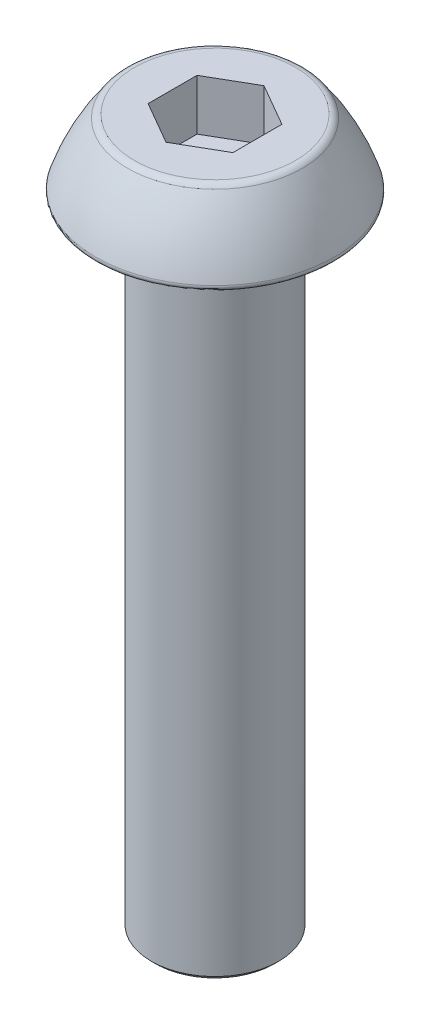
ISO-10303-21;
HEADER;
FILE_DESCRIPTION(('STEP AP214'),'2;1');
FILE_NAME('part.step','',(''),(''),'','','');
FILE_SCHEMA(('AUTOMOTIVE_DESIGN { 1 0 10303 214 1 1 1 1 }'));
ENDSEC;
DATA;
#1=APPLICATION_CONTEXT('core data for automotive mechanical design processes');
#2=APPLICATION_PROTOCOL_DEFINITION('international standard','automotive_design',2000,#1);
#3=PRODUCT_CONTEXT('',#1,'mechanical');
#4=PRODUCT('Part','Part','',(#3));
#5=PRODUCT_RELATED_PRODUCT_CATEGORY('part','',(#4));
#6=PRODUCT_DEFINITION_FORMATION('','',#4);
#7=PRODUCT_DEFINITION_CONTEXT('part definition',#1,'design');
#8=PRODUCT_DEFINITION('design','',#6,#7);
#9=PRODUCT_DEFINITION_SHAPE('','',#8);
#10=(LENGTH_UNIT() NAMED_UNIT(*) SI_UNIT(.MILLI.,.METRE.));
#11=(NAMED_UNIT(*) PLANE_ANGLE_UNIT() SI_UNIT($,.RADIAN.));
#12=(NAMED_UNIT(*) SI_UNIT($,.STERADIAN.) SOLID_ANGLE_UNIT());
#13=UNCERTAINTY_MEASURE_WITH_UNIT(LENGTH_MEASURE(1.E-05),#10,'distance_accuracy_value','');
#14=(GEOMETRIC_REPRESENTATION_CONTEXT(3) GLOBAL_UNCERTAINTY_ASSIGNED_CONTEXT((#13)) GLOBAL_UNIT_ASSIGNED_CONTEXT((#10,
#11,#12)) REPRESENTATION_CONTEXT('',''));
#15=CARTESIAN_POINT('',(0.,0.,0.));
#16=DIRECTION('',(0.,0.,1.));
#17=DIRECTION('',(1.,0.,0.));
#18=AXIS2_PLACEMENT_3D('',#15,#16,#17);
#19=CARTESIAN_POINT('',(0.,0.,0.));
#20=DIRECTION('',(0.,1.,0.));
#21=DIRECTION('',(0.,0.,1.));
#22=AXIS2_PLACEMENT_3D('',#19,#20,#21);
#23=PLANE('',#22);
#24=CARTESIAN_POINT('',(0.,0.,0.));
#25=DIRECTION('',(0.,1.,0.));
#26=DIRECTION('',(0.,0.,1.));
#27=AXIS2_PLACEMENT_3D('',#24,#25,#26);
#28=CIRCLE('',#27,2.71401101775283);
#29=CARTESIAN_POINT('',(0.,0.,2.71401101775283));
#30=VERTEX_POINT('',#29);
#31=EDGE_CURVE('E118',#30,#30,#28,.F.);
#32=ORIENTED_EDGE('',*,*,#31,.T.);
#33=EDGE_LOOP('',(#32));
#34=FACE_BOUND('',#33,.T.);
#35=CARTESIAN_POINT('',(0.,0.,0.));
#36=DIRECTION('',(0.,1.,0.));
#37=DIRECTION('',(0.,0.,1.));
#38=AXIS2_PLACEMENT_3D('',#35,#36,#37);
#39=CIRCLE('',#38,1.5);
#40=CARTESIAN_POINT('',(0.,0.,1.5));
#41=VERTEX_POINT('',#40);
#42=EDGE_CURVE('E137',#41,#41,#39,.F.);
#43=ORIENTED_EDGE('',*,*,#42,.F.);
#44=EDGE_LOOP('',(#43));
#45=FACE_BOUND('',#44,.T.);
#46=ADVANCED_FACE('F17',(#34,#45),#23,.F.);
#47=CARTESIAN_POINT('',(-2.,1.65,0.));
#48=DIRECTION('',(0.,-1.,0.));
#49=DIRECTION('',(0.,0.,-1.));
#50=AXIS2_PLACEMENT_3D('',#47,#48,#49);
#51=PLANE('',#50);
#52=DIRECTION('',(-0.866025403784439,0.,0.5));
#53=VECTOR('',#52,1.);
#54=CARTESIAN_POINT('',(0.,1.65,-1.15470053837925));
#55=LINE('',#54,#53);
#56=CARTESIAN_POINT('',(0.,1.65,-1.15470053837925));
#57=VERTEX_POINT('',#56);
#58=CARTESIAN_POINT('',(-1.,1.65,-0.577350269189626));
#59=VERTEX_POINT('',#58);
#60=EDGE_CURVE('E106',#57,#59,#55,.T.);
#61=ORIENTED_EDGE('',*,*,#60,.F.);
#62=DIRECTION('',(-0.866025403784439,0.,-0.5));
#63=VECTOR('',#62,1.);
#64=CARTESIAN_POINT('',(1.,1.65,-0.577350269189626));
#65=LINE('',#64,#63);
#66=CARTESIAN_POINT('',(1.,1.65,-0.577350269189626));
#67=VERTEX_POINT('',#66);
#68=EDGE_CURVE('E32',#67,#57,#65,.T.);
#69=ORIENTED_EDGE('',*,*,#68,.F.);
#70=DIRECTION('',(0.,0.,-1.));
#71=VECTOR('',#70,1.);
#72=CARTESIAN_POINT('',(1.,1.65,0.577350269189626));
#73=LINE('',#72,#71);
#74=CARTESIAN_POINT('',(1.,1.65,0.577350269189626));
#75=VERTEX_POINT('',#74);
#76=EDGE_CURVE('E113',#75,#67,#73,.T.);
#77=ORIENTED_EDGE('',*,*,#76,.F.);
#78=DIRECTION('',(0.866025403784439,0.,-0.5));
#79=VECTOR('',#78,1.);
#80=CARTESIAN_POINT('',(0.,1.65,1.15470053837925));
#81=LINE('',#80,#79);
#82=CARTESIAN_POINT('',(0.,1.65,1.15470053837925));
#83=VERTEX_POINT('',#82);
#84=EDGE_CURVE('E114',#83,#75,#81,.T.);
#85=ORIENTED_EDGE('',*,*,#84,.F.);
#86=DIRECTION('',(0.866025403784439,0.,0.5));
#87=VECTOR('',#86,1.);
#88=CARTESIAN_POINT('',(-1.,1.65,0.577350269189626));
#89=LINE('',#88,#87);
#90=CARTESIAN_POINT('',(-1.,1.65,0.577350269189626));
#91=VERTEX_POINT('',#90);
#92=EDGE_CURVE('E79',#91,#83,#89,.T.);
#93=ORIENTED_EDGE('',*,*,#92,.F.);
#94=DIRECTION('',(0.,0.,1.));
#95=VECTOR('',#94,1.);
#96=CARTESIAN_POINT('',(-1.,1.65,-0.577350269189626));
#97=LINE('',#96,#95);
#98=EDGE_CURVE('E108',#59,#91,#97,.T.);
#99=ORIENTED_EDGE('',*,*,#98,.F.);
#100=EDGE_LOOP('',(#61,#69,#77,#85,#93,#99));
#101=FACE_BOUND('',#100,.T.);
#102=CARTESIAN_POINT('',(0.,1.65,0.));
#103=DIRECTION('',(0.,-1.,0.));
#104=DIRECTION('',(0.,0.,-1.));
#105=AXIS2_PLACEMENT_3D('',#102,#103,#104);
#106=CIRCLE('',#105,1.90110924353599);
#107=CARTESIAN_POINT('',(0.,1.65,-1.90110924353599));
#108=VERTEX_POINT('',#107);
#109=EDGE_CURVE('E132',#108,#108,#106,.F.);
#110=ORIENTED_EDGE('',*,*,#109,.T.);
#111=EDGE_LOOP('',(#110));
#112=FACE_BOUND('',#111,.T.);
#113=ADVANCED_FACE('F152',(#101,#112),#51,.F.);
#114=CARTESIAN_POINT('',(0.,-1.42499576680782,0.));
#115=DIRECTION('',(0.,-1.,0.));
#116=DIRECTION('',(0.,0.,-1.));
#117=AXIS2_PLACEMENT_3D('',#114,#115,#116);
#118=DEGENERATE_TOROIDAL_SURFACE('',#117,1.94263884145048,5.,.F.);
#119=CARTESIAN_POINT('',(0.,1.56979149028366,0.));
#120=DIRECTION('',(0.,-1.,0.));
#121=DIRECTION('',(0.,0.,-1.));
#122=AXIS2_PLACEMENT_3D('',#119,#120,#121);
#123=CIRCLE('',#122,2.06126541374375);
#124=CARTESIAN_POINT('',(0.,1.56979149028366,-2.06126541374375));
#125=VERTEX_POINT('',#124);
#126=EDGE_CURVE('E129',#125,#125,#123,.T.);
#127=ORIENTED_EDGE('',*,*,#126,.T.);
#128=EDGE_LOOP('',(#127));
#129=FACE_BOUND('',#128,.T.);
#130=CARTESIAN_POINT('',(0.,0.131122362587915,0.));
#131=DIRECTION('',(0.,-1.,0.));
#132=DIRECTION('',(0.,0.,-1.));
#133=AXIS2_PLACEMENT_3D('',#130,#131,#132);
#134=CIRCLE('',#133,2.80904468834882);
#135=CARTESIAN_POINT('',(0.,0.131122362587915,-2.80904468834882));
#136=VERTEX_POINT('',#135);
#137=EDGE_CURVE('E126',#136,#136,#134,.F.);
#138=ORIENTED_EDGE('',*,*,#137,.T.);
#139=EDGE_LOOP('',(#138));
#140=FACE_BOUND('',#139,.T.);
#141=ADVANCED_FACE('F161',(#129,#140),#118,.F.);
#142=CARTESIAN_POINT('',(0.,0.1,0.));
#143=DIRECTION('',(0.,1.,0.));
#144=DIRECTION('',(0.,0.,1.));
#145=AXIS2_PLACEMENT_3D('',#142,#143,#144);
#146=TOROIDAL_SURFACE('',#145,2.71401101775283,0.1);
#147=ORIENTED_EDGE('',*,*,#137,.F.);
#148=EDGE_LOOP('',(#147));
#149=FACE_BOUND('',#148,.T.);
#150=ORIENTED_EDGE('',*,*,#31,.F.);
#151=EDGE_LOOP('',(#150));
#152=FACE_BOUND('',#151,.T.);
#153=ADVANCED_FACE('F168',(#149,#152),#146,.T.);
#154=CARTESIAN_POINT('',(0.,1.45,0.));
#155=DIRECTION('',(0.,-1.,0.));
#156=DIRECTION('',(0.,0.,-1.));
#157=AXIS2_PLACEMENT_3D('',#154,#155,#156);
#158=TOROIDAL_SURFACE('',#157,1.90110924353599,0.2);
#159=ORIENTED_EDGE('',*,*,#109,.F.);
#160=EDGE_LOOP('',(#159));
#161=FACE_BOUND('',#160,.T.);
#162=ORIENTED_EDGE('',*,*,#126,.F.);
#163=EDGE_LOOP('',(#162));
#164=FACE_BOUND('',#163,.T.);
#165=ADVANCED_FACE('F173',(#161,#164),#158,.T.);
#166=CARTESIAN_POINT('',(1.,0.45,-0.577350269189626));
#167=DIRECTION('',(0.5,0.,-0.866025403784439));
#168=DIRECTION('',(-0.866025403784439,0.,-0.5));
#169=AXIS2_PLACEMENT_3D('',#166,#167,#168);
#170=PLANE('',#169);
#171=ORIENTED_EDGE('',*,*,#68,.T.);
#172=DIRECTION('',(0.,1.,0.));
#173=VECTOR('',#172,1.);
#174=CARTESIAN_POINT('',(0.,0.45,-1.15470053837925));
#175=LINE('',#174,#173);
#176=CARTESIAN_POINT('',(0.,0.45,-1.15470053837925));
#177=VERTEX_POINT('',#176);
#178=EDGE_CURVE('E62',#177,#57,#175,.T.);
#179=ORIENTED_EDGE('',*,*,#178,.F.);
#180=DIRECTION('',(-0.866025403784439,0.,-0.5));
#181=VECTOR('',#180,1.);
#182=CARTESIAN_POINT('',(1.,0.45,-0.577350269189626));
#183=LINE('',#182,#181);
#184=CARTESIAN_POINT('',(1.,0.45,-0.577350269189626));
#185=VERTEX_POINT('',#184);
#186=EDGE_CURVE('E117',#185,#177,#183,.T.);
#187=ORIENTED_EDGE('',*,*,#186,.F.);
#188=DIRECTION('',(0.,1.,0.));
#189=VECTOR('',#188,1.);
#190=CARTESIAN_POINT('',(1.,0.45,-0.577350269189626));
#191=LINE('',#190,#189);
#192=EDGE_CURVE('E37',#185,#67,#191,.T.);
#193=ORIENTED_EDGE('',*,*,#192,.T.);
#194=EDGE_LOOP('',(#171,#179,#187,#193));
#195=FACE_BOUND('',#194,.T.);
#196=ADVANCED_FACE('F170',(#195),#170,.F.);
#197=CARTESIAN_POINT('',(1.,0.45,0.577350269189626));
#198=DIRECTION('',(1.,0.,0.));
#199=DIRECTION('',(0.,0.,-1.));
#200=AXIS2_PLACEMENT_3D('',#197,#198,#199);
#201=PLANE('',#200);
#202=ORIENTED_EDGE('',*,*,#76,.T.);
#203=ORIENTED_EDGE('',*,*,#192,.F.);
#204=DIRECTION('',(0.,0.,-1.));
#205=VECTOR('',#204,1.);
#206=CARTESIAN_POINT('',(1.,0.45,0.577350269189626));
#207=LINE('',#206,#205);
#208=CARTESIAN_POINT('',(1.,0.45,0.577350269189626));
#209=VERTEX_POINT('',#208);
#210=EDGE_CURVE('E95',#209,#185,#207,.T.);
#211=ORIENTED_EDGE('',*,*,#210,.F.);
#212=DIRECTION('',(0.,1.,0.));
#213=VECTOR('',#212,1.);
#214=CARTESIAN_POINT('',(1.,0.45,0.577350269189626));
#215=LINE('',#214,#213);
#216=EDGE_CURVE('E81',#209,#75,#215,.T.);
#217=ORIENTED_EDGE('',*,*,#216,.T.);
#218=EDGE_LOOP('',(#202,#203,#211,#217));
#219=FACE_BOUND('',#218,.T.);
#220=ADVANCED_FACE('F181',(#219),#201,.F.);
#221=CARTESIAN_POINT('',(0.,0.45,1.15470053837925));
#222=DIRECTION('',(0.5,0.,0.866025403784439));
#223=DIRECTION('',(0.866025403784439,0.,-0.5));
#224=AXIS2_PLACEMENT_3D('',#221,#222,#223);
#225=PLANE('',#224);
#226=ORIENTED_EDGE('',*,*,#84,.T.);
#227=ORIENTED_EDGE('',*,*,#216,.F.);
#228=DIRECTION('',(0.866025403784439,0.,-0.5));
#229=VECTOR('',#228,1.);
#230=CARTESIAN_POINT('',(0.,0.45,1.15470053837925));
#231=LINE('',#230,#229);
#232=CARTESIAN_POINT('',(0.,0.45,1.15470053837925));
#233=VERTEX_POINT('',#232);
#234=EDGE_CURVE('E86',#233,#209,#231,.T.);
#235=ORIENTED_EDGE('',*,*,#234,.F.);
#236=DIRECTION('',(0.,1.,0.));
#237=VECTOR('',#236,1.);
#238=CARTESIAN_POINT('',(0.,0.45,1.15470053837925));
#239=LINE('',#238,#237);
#240=EDGE_CURVE('E73',#233,#83,#239,.T.);
#241=ORIENTED_EDGE('',*,*,#240,.T.);
#242=EDGE_LOOP('',(#226,#227,#235,#241));
#243=FACE_BOUND('',#242,.T.);
#244=ADVANCED_FACE('F90',(#243),#225,.F.);
#245=CARTESIAN_POINT('',(-1.,0.45,0.577350269189626));
#246=DIRECTION('',(-0.5,0.,0.866025403784439));
#247=DIRECTION('',(0.866025403784439,0.,0.5));
#248=AXIS2_PLACEMENT_3D('',#245,#246,#247);
#249=PLANE('',#248);
#250=ORIENTED_EDGE('',*,*,#92,.T.);
#251=ORIENTED_EDGE('',*,*,#240,.F.);
#252=DIRECTION('',(0.866025403784439,0.,0.5));
#253=VECTOR('',#252,1.);
#254=CARTESIAN_POINT('',(-1.,0.45,0.577350269189626));
#255=LINE('',#254,#253);
#256=CARTESIAN_POINT('',(-1.,0.45,0.577350269189626));
#257=VERTEX_POINT('',#256);
#258=EDGE_CURVE('E80',#257,#233,#255,.T.);
#259=ORIENTED_EDGE('',*,*,#258,.F.);
#260=DIRECTION('',(0.,1.,0.));
#261=VECTOR('',#260,1.);
#262=CARTESIAN_POINT('',(-1.,0.45,0.577350269189626));
#263=LINE('',#262,#261);
#264=EDGE_CURVE('E83',#257,#91,#263,.T.);
#265=ORIENTED_EDGE('',*,*,#264,.T.);
#266=EDGE_LOOP('',(#250,#251,#259,#265));
#267=FACE_BOUND('',#266,.T.);
#268=ADVANCED_FACE('F74',(#267),#249,.F.);
#269=CARTESIAN_POINT('',(-1.,0.45,-0.577350269189626));
#270=DIRECTION('',(-1.,0.,0.));
#271=DIRECTION('',(0.,0.,1.));
#272=AXIS2_PLACEMENT_3D('',#269,#270,#271);
#273=PLANE('',#272);
#274=ORIENTED_EDGE('',*,*,#98,.T.);
#275=ORIENTED_EDGE('',*,*,#264,.F.);
#276=DIRECTION('',(0.,0.,1.));
#277=VECTOR('',#276,1.);
#278=CARTESIAN_POINT('',(-1.,0.45,-0.577350269189626));
#279=LINE('',#278,#277);
#280=CARTESIAN_POINT('',(-1.,0.45,-0.577350269189626));
#281=VERTEX_POINT('',#280);
#282=EDGE_CURVE('E98',#281,#257,#279,.T.);
#283=ORIENTED_EDGE('',*,*,#282,.F.);
#284=DIRECTION('',(0.,1.,0.));
#285=VECTOR('',#284,1.);
#286=CARTESIAN_POINT('',(-1.,0.45,-0.577350269189626));
#287=LINE('',#286,#285);
#288=EDGE_CURVE('E121',#281,#59,#287,.T.);
#289=ORIENTED_EDGE('',*,*,#288,.T.);
#290=EDGE_LOOP('',(#274,#275,#283,#289));
#291=FACE_BOUND('',#290,.T.);
#292=ADVANCED_FACE('F206',(#291),#273,.F.);
#293=CARTESIAN_POINT('',(0.,0.45,-1.15470053837925));
#294=DIRECTION('',(-0.5,0.,-0.866025403784439));
#295=DIRECTION('',(-0.866025403784439,0.,0.5));
#296=AXIS2_PLACEMENT_3D('',#293,#294,#295);
#297=PLANE('',#296);
#298=ORIENTED_EDGE('',*,*,#60,.T.);
#299=ORIENTED_EDGE('',*,*,#288,.F.);
#300=DIRECTION('',(-0.866025403784439,0.,0.5));
#301=VECTOR('',#300,1.);
#302=CARTESIAN_POINT('',(0.,0.45,-1.15470053837925));
#303=LINE('',#302,#301);
#304=EDGE_CURVE('E99',#177,#281,#303,.T.);
#305=ORIENTED_EDGE('',*,*,#304,.F.);
#306=ORIENTED_EDGE('',*,*,#178,.T.);
#307=EDGE_LOOP('',(#298,#299,#305,#306));
#308=FACE_BOUND('',#307,.T.);
#309=ADVANCED_FACE('F208',(#308),#297,.F.);
#310=CARTESIAN_POINT('',(0.,0.45,0.));
#311=DIRECTION('',(0.,1.,0.));
#312=DIRECTION('',(0.,0.,1.));
#313=AXIS2_PLACEMENT_3D('',#310,#311,#312);
#314=PLANE('',#313);
#315=ORIENTED_EDGE('',*,*,#186,.T.);
#316=ORIENTED_EDGE('',*,*,#304,.T.);
#317=ORIENTED_EDGE('',*,*,#282,.T.);
#318=ORIENTED_EDGE('',*,*,#258,.T.);
#319=ORIENTED_EDGE('',*,*,#234,.T.);
#320=ORIENTED_EDGE('',*,*,#210,.T.);
#321=EDGE_LOOP('',(#315,#316,#317,#318,#319,#320));
#322=FACE_BOUND('',#321,.T.);
#323=ADVANCED_FACE('F92',(#322),#314,.T.);
#324=CARTESIAN_POINT('',(0.,-15.,0.));
#325=DIRECTION('',(0.,1.,0.));
#326=DIRECTION('',(0.,0.,1.));
#327=AXIS2_PLACEMENT_3D('',#324,#325,#326);
#328=CYLINDRICAL_SURFACE('',#327,1.5);
#329=CARTESIAN_POINT('',(0.,-14.9,0.));
#330=DIRECTION('',(0.,-1.,0.));
#331=DIRECTION('',(0.,0.,-1.));
#332=AXIS2_PLACEMENT_3D('',#329,#330,#331);
#333=CIRCLE('',#332,1.5);
#334=CARTESIAN_POINT('',(0.,-14.9,-1.5));
#335=VERTEX_POINT('',#334);
#336=EDGE_CURVE('E11',#335,#335,#333,.F.);
#337=ORIENTED_EDGE('',*,*,#336,.T.);
#338=EDGE_LOOP('',(#337));
#339=FACE_BOUND('',#338,.T.);
#340=ORIENTED_EDGE('',*,*,#42,.T.);
#341=EDGE_LOOP('',(#340));
#342=FACE_BOUND('',#341,.T.);
#343=ADVANCED_FACE('F147',(#339,#342),#328,.T.);
#344=CARTESIAN_POINT('',(0.,-15.,0.));
#345=DIRECTION('',(0.,-1.,0.));
#346=DIRECTION('',(0.,0.,-1.));
#347=AXIS2_PLACEMENT_3D('',#344,#345,#346);
#348=PLANE('',#347);
#349=CARTESIAN_POINT('',(0.,-15.,0.));
#350=DIRECTION('',(0.,-1.,0.));
#351=DIRECTION('',(0.,0.,-1.));
#352=AXIS2_PLACEMENT_3D('',#349,#350,#351);
#353=CIRCLE('',#352,1.4);
#354=CARTESIAN_POINT('',(0.,-15.,-1.4));
#355=VERTEX_POINT('',#354);
#356=EDGE_CURVE('E25',#355,#355,#353,.T.);
#357=ORIENTED_EDGE('',*,*,#356,.T.);
#358=EDGE_LOOP('',(#357));
#359=FACE_BOUND('',#358,.T.);
#360=ADVANCED_FACE('F143',(#359),#348,.T.);
#361=CARTESIAN_POINT('',(0.,-15.,0.));
#362=DIRECTION('',(0.,1.,0.));
#363=DIRECTION('',(0.,0.,1.));
#364=AXIS2_PLACEMENT_3D('',#361,#362,#363);
#365=CONICAL_SURFACE('',#364,1.4,0.785398163397453);
#366=ORIENTED_EDGE('',*,*,#336,.F.);
#367=EDGE_LOOP('',(#366));
#368=FACE_BOUND('',#367,.T.);
#369=ORIENTED_EDGE('',*,*,#356,.F.);
#370=EDGE_LOOP('',(#369));
#371=FACE_BOUND('',#370,.T.);
#372=ADVANCED_FACE('F19',(#368,#371),#365,.T.);
#373=CLOSED_SHELL('',(#46,#113,#141,#153,#165,#196,#220,#244,#268,#292,#309,#323,#343,#360,#372));
#374=MANIFOLD_SOLID_BREP('B1',#373);
#375=ADVANCED_BREP_SHAPE_REPRESENTATION('',(#18,#374),#14);
#376=SHAPE_DEFINITION_REPRESENTATION(#9,#375);
ENDSEC;
END-ISO-10303-21;
